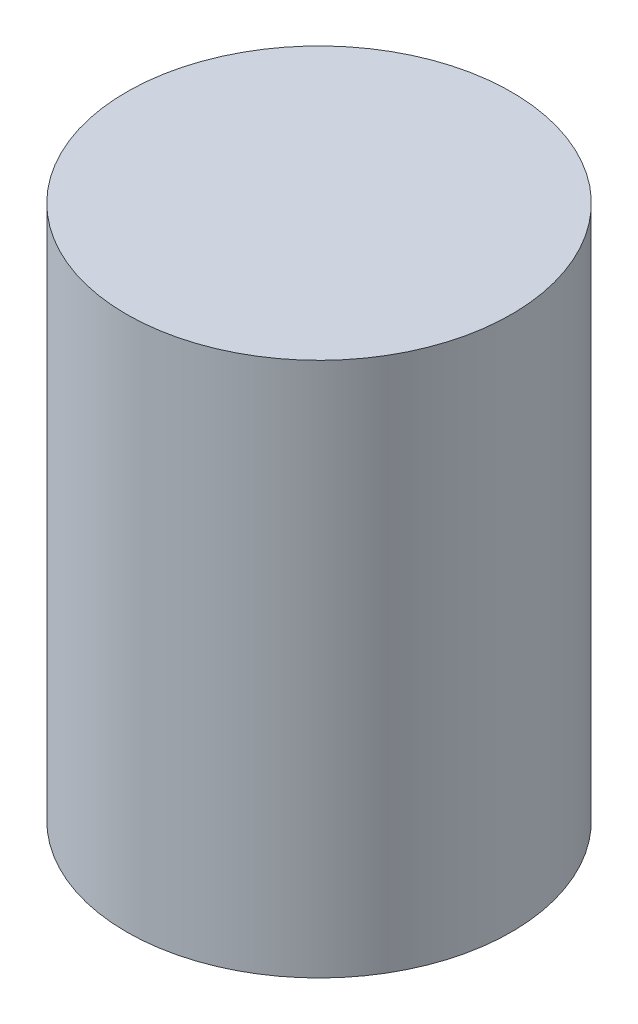
ISO-10303-21;
HEADER;
FILE_DESCRIPTION(('STEP AP214'),'2;1');
FILE_NAME('part.step','',(''),(''),'','','');
FILE_SCHEMA(('AUTOMOTIVE_DESIGN { 1 0 10303 214 1 1 1 1 }'));
ENDSEC;
DATA;
#1=APPLICATION_CONTEXT('core data for automotive mechanical design processes');
#2=APPLICATION_PROTOCOL_DEFINITION('international standard','automotive_design',2000,#1);
#3=PRODUCT_CONTEXT('',#1,'mechanical');
#4=PRODUCT('Part','Part','',(#3));
#5=PRODUCT_RELATED_PRODUCT_CATEGORY('part','',(#4));
#6=PRODUCT_DEFINITION_FORMATION('','',#4);
#7=PRODUCT_DEFINITION_CONTEXT('part definition',#1,'design');
#8=PRODUCT_DEFINITION('design','',#6,#7);
#9=PRODUCT_DEFINITION_SHAPE('','',#8);
#10=(LENGTH_UNIT() NAMED_UNIT(*) SI_UNIT(.MILLI.,.METRE.));
#11=(NAMED_UNIT(*) PLANE_ANGLE_UNIT() SI_UNIT($,.RADIAN.));
#12=(NAMED_UNIT(*) SI_UNIT($,.STERADIAN.) SOLID_ANGLE_UNIT());
#13=UNCERTAINTY_MEASURE_WITH_UNIT(LENGTH_MEASURE(1.E-05),#10,'distance_accuracy_value','');
#14=(GEOMETRIC_REPRESENTATION_CONTEXT(3) GLOBAL_UNCERTAINTY_ASSIGNED_CONTEXT((#13)) GLOBAL_UNIT_ASSIGNED_CONTEXT((#10,
#11,#12)) REPRESENTATION_CONTEXT('',''));
#15=CARTESIAN_POINT('',(0.,0.,0.));
#16=DIRECTION('',(0.,0.,1.));
#17=DIRECTION('',(1.,0.,0.));
#18=AXIS2_PLACEMENT_3D('',#15,#16,#17);
#19=CARTESIAN_POINT('',(0.,177.8,0.));
#20=DIRECTION('',(0.,-1.,0.));
#21=DIRECTION('',(0.,0.,-1.));
#22=AXIS2_PLACEMENT_3D('',#19,#20,#21);
#23=CYLINDRICAL_SURFACE('',#22,64.000000016);
#24=CARTESIAN_POINT('',(0.,177.8,0.));
#25=DIRECTION('',(0.,1.,0.));
#26=DIRECTION('',(0.,0.,1.));
#27=AXIS2_PLACEMENT_3D('',#24,#25,#26);
#28=CIRCLE('',#27,64.000000016);
#29=CARTESIAN_POINT('',(0.,177.8,64.000000016));
#30=VERTEX_POINT('',#29);
#31=EDGE_CURVE('E10',#30,#30,#28,.T.);
#32=ORIENTED_EDGE('',*,*,#31,.F.);
#33=EDGE_LOOP('',(#32));
#34=FACE_BOUND('',#33,.T.);
#35=CARTESIAN_POINT('',(0.,0.,0.));
#36=DIRECTION('',(0.,1.,0.));
#37=DIRECTION('',(0.,0.,1.));
#38=AXIS2_PLACEMENT_3D('',#35,#36,#37);
#39=CIRCLE('',#38,64.000000016);
#40=CARTESIAN_POINT('',(0.,0.,64.000000016));
#41=VERTEX_POINT('',#40);
#42=EDGE_CURVE('E34',#41,#41,#39,.T.);
#43=ORIENTED_EDGE('',*,*,#42,.T.);
#44=EDGE_LOOP('',(#43));
#45=FACE_BOUND('',#44,.T.);
#46=ADVANCED_FACE('F31',(#34,#45),#23,.T.);
#47=CARTESIAN_POINT('',(0.,177.8,0.));
#48=DIRECTION('',(0.,1.,0.));
#49=DIRECTION('',(0.,0.,1.));
#50=AXIS2_PLACEMENT_3D('',#47,#48,#49);
#51=PLANE('',#50);
#52=ORIENTED_EDGE('',*,*,#31,.T.);
#53=EDGE_LOOP('',(#52));
#54=FACE_BOUND('',#53,.T.);
#55=ADVANCED_FACE('F46',(#54),#51,.T.);
#56=CARTESIAN_POINT('',(0.,0.,0.));
#57=DIRECTION('',(0.,1.,0.));
#58=DIRECTION('',(0.,0.,1.));
#59=AXIS2_PLACEMENT_3D('',#56,#57,#58);
#60=PLANE('',#59);
#61=ORIENTED_EDGE('',*,*,#42,.F.);
#62=EDGE_LOOP('',(#61));
#63=FACE_BOUND('',#62,.T.);
#64=ADVANCED_FACE('F44',(#63),#60,.F.);
#65=CLOSED_SHELL('',(#46,#55,#64));
#66=MANIFOLD_SOLID_BREP('B2',#65);
#67=ADVANCED_BREP_SHAPE_REPRESENTATION('',(#18,#66),#14);
#68=SHAPE_DEFINITION_REPRESENTATION(#9,#67);
ENDSEC;
END-ISO-10303-21;
